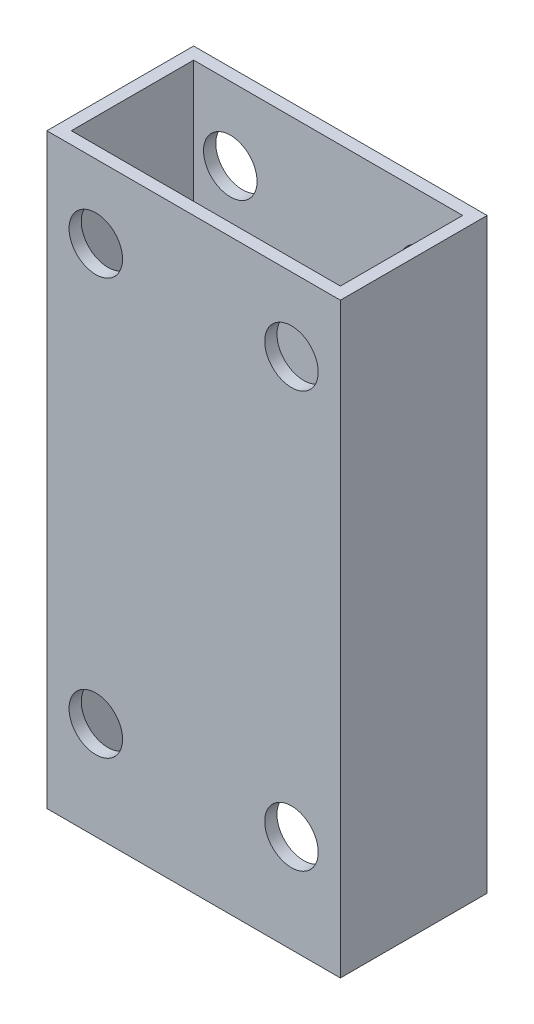
ISO-10303-21;
HEADER;
FILE_DESCRIPTION(('STEP AP214'),'2;1');
FILE_NAME('part.step','',(''),(''),'','','');
FILE_SCHEMA(('AUTOMOTIVE_DESIGN { 1 0 10303 214 1 1 1 1 }'));
ENDSEC;
DATA;
#1=APPLICATION_CONTEXT('core data for automotive mechanical design processes');
#2=APPLICATION_PROTOCOL_DEFINITION('international standard','automotive_design',2000,#1);
#3=PRODUCT_CONTEXT('',#1,'mechanical');
#4=PRODUCT('Part','Part','',(#3));
#5=PRODUCT_RELATED_PRODUCT_CATEGORY('part','',(#4));
#6=PRODUCT_DEFINITION_FORMATION('','',#4);
#7=PRODUCT_DEFINITION_CONTEXT('part definition',#1,'design');
#8=PRODUCT_DEFINITION('design','',#6,#7);
#9=PRODUCT_DEFINITION_SHAPE('','',#8);
#10=(LENGTH_UNIT() NAMED_UNIT(*) SI_UNIT(.MILLI.,.METRE.));
#11=(NAMED_UNIT(*) PLANE_ANGLE_UNIT() SI_UNIT($,.RADIAN.));
#12=(NAMED_UNIT(*) SI_UNIT($,.STERADIAN.) SOLID_ANGLE_UNIT());
#13=UNCERTAINTY_MEASURE_WITH_UNIT(LENGTH_MEASURE(1.E-05),#10,'distance_accuracy_value','');
#14=(GEOMETRIC_REPRESENTATION_CONTEXT(3) GLOBAL_UNCERTAINTY_ASSIGNED_CONTEXT((#13)) GLOBAL_UNIT_ASSIGNED_CONTEXT((#10,
#11,#12)) REPRESENTATION_CONTEXT('',''));
#15=CARTESIAN_POINT('',(0.,0.,0.));
#16=DIRECTION('',(0.,0.,1.));
#17=DIRECTION('',(1.,0.,0.));
#18=AXIS2_PLACEMENT_3D('',#15,#16,#17);
#19=CARTESIAN_POINT('',(38.1,76.2,19.05));
#20=DIRECTION('',(-1.,0.,0.));
#21=DIRECTION('',(0.,0.,1.));
#22=AXIS2_PLACEMENT_3D('',#19,#20,#21);
#23=PLANE('',#22);
#24=DIRECTION('',(0.,0.,-1.));
#25=VECTOR('',#24,1.);
#26=CARTESIAN_POINT('',(38.1,-76.2,19.05));
#27=LINE('',#26,#25);
#28=CARTESIAN_POINT('',(38.1,-76.2,19.05));
#29=VERTEX_POINT('',#28);
#30=CARTESIAN_POINT('',(38.1,-76.2,-19.05));
#31=VERTEX_POINT('',#30);
#32=EDGE_CURVE('E134',#29,#31,#27,.T.);
#33=ORIENTED_EDGE('',*,*,#32,.T.);
#34=DIRECTION('',(0.,-1.,0.));
#35=VECTOR('',#34,1.);
#36=CARTESIAN_POINT('',(38.1,76.2,-19.05));
#37=LINE('',#36,#35);
#38=CARTESIAN_POINT('',(38.1,76.2,-19.05));
#39=VERTEX_POINT('',#38);
#40=EDGE_CURVE('E11',#39,#31,#37,.T.);
#41=ORIENTED_EDGE('',*,*,#40,.F.);
#42=DIRECTION('',(0.,0.,-1.));
#43=VECTOR('',#42,1.);
#44=CARTESIAN_POINT('',(38.1,76.2,19.05));
#45=LINE('',#44,#43);
#46=CARTESIAN_POINT('',(38.1,76.2,19.05));
#47=VERTEX_POINT('',#46);
#48=EDGE_CURVE('E138',#47,#39,#45,.T.);
#49=ORIENTED_EDGE('',*,*,#48,.F.);
#50=DIRECTION('',(0.,-1.,0.));
#51=VECTOR('',#50,1.);
#52=CARTESIAN_POINT('',(38.1,76.2,19.05));
#53=LINE('',#52,#51);
#54=EDGE_CURVE('E148',#47,#29,#53,.T.);
#55=ORIENTED_EDGE('',*,*,#54,.T.);
#56=EDGE_LOOP('',(#33,#41,#49,#55));
#57=FACE_BOUND('',#56,.T.);
#58=ADVANCED_FACE('F32',(#57),#23,.F.);
#59=CARTESIAN_POINT('',(-38.1,76.2,-19.05));
#60=DIRECTION('',(0.,0.,1.));
#61=DIRECTION('',(1.,0.,0.));
#62=AXIS2_PLACEMENT_3D('',#59,#60,#61);
#63=PLANE('',#62);
#64=CARTESIAN_POINT('',(25.4,57.15,-19.05));
#65=DIRECTION('',(0.,0.,1.));
#66=DIRECTION('',(1.,0.,0.));
#67=AXIS2_PLACEMENT_3D('',#64,#65,#66);
#68=CIRCLE('',#67,6.94562999999999);
#69=CARTESIAN_POINT('',(32.34563,57.15,-19.05));
#70=VERTEX_POINT('',#69);
#71=EDGE_CURVE('E396',#70,#70,#68,.T.);
#72=ORIENTED_EDGE('',*,*,#71,.T.);
#73=EDGE_LOOP('',(#72));
#74=FACE_BOUND('',#73,.T.);
#75=CARTESIAN_POINT('',(-25.4,57.15,-19.05));
#76=DIRECTION('',(0.,0.,1.));
#77=DIRECTION('',(1.,0.,0.));
#78=AXIS2_PLACEMENT_3D('',#75,#76,#77);
#79=CIRCLE('',#78,6.94562999999999);
#80=CARTESIAN_POINT('',(-18.45437,57.15,-19.05));
#81=VERTEX_POINT('',#80);
#82=EDGE_CURVE('E170',#81,#81,#79,.T.);
#83=ORIENTED_EDGE('',*,*,#82,.T.);
#84=EDGE_LOOP('',(#83));
#85=FACE_BOUND('',#84,.T.);
#86=CARTESIAN_POINT('',(-25.4,-50.8,-19.05));
#87=DIRECTION('',(0.,0.,1.));
#88=DIRECTION('',(1.,0.,0.));
#89=AXIS2_PLACEMENT_3D('',#86,#87,#88);
#90=CIRCLE('',#89,6.94562999999999);
#91=CARTESIAN_POINT('',(-18.45437,-50.8,-19.05));
#92=VERTEX_POINT('',#91);
#93=EDGE_CURVE('E166',#92,#92,#90,.T.);
#94=ORIENTED_EDGE('',*,*,#93,.T.);
#95=EDGE_LOOP('',(#94));
#96=FACE_BOUND('',#95,.T.);
#97=CARTESIAN_POINT('',(25.4,-50.8,-19.05));
#98=DIRECTION('',(0.,0.,1.));
#99=DIRECTION('',(1.,0.,0.));
#100=AXIS2_PLACEMENT_3D('',#97,#98,#99);
#101=CIRCLE('',#100,6.94562999999999);
#102=CARTESIAN_POINT('',(32.34563,-50.8,-19.05));
#103=VERTEX_POINT('',#102);
#104=EDGE_CURVE('E195',#103,#103,#101,.T.);
#105=ORIENTED_EDGE('',*,*,#104,.T.);
#106=EDGE_LOOP('',(#105));
#107=FACE_BOUND('',#106,.T.);
#108=DIRECTION('',(-1.,0.,0.));
#109=VECTOR('',#108,1.);
#110=CARTESIAN_POINT('',(-38.1,-76.2,-19.05));
#111=LINE('',#110,#109);
#112=CARTESIAN_POINT('',(-38.1,-76.2,-19.05));
#113=VERTEX_POINT('',#112);
#114=EDGE_CURVE('E151',#31,#113,#111,.T.);
#115=ORIENTED_EDGE('',*,*,#114,.T.);
#116=DIRECTION('',(0.,-1.,0.));
#117=VECTOR('',#116,1.);
#118=CARTESIAN_POINT('',(-38.1,76.2,-19.05));
#119=LINE('',#118,#117);
#120=CARTESIAN_POINT('',(-38.1,76.2,-19.05));
#121=VERTEX_POINT('',#120);
#122=EDGE_CURVE('E40',#121,#113,#119,.T.);
#123=ORIENTED_EDGE('',*,*,#122,.F.);
#124=DIRECTION('',(-1.,0.,0.));
#125=VECTOR('',#124,1.);
#126=CARTESIAN_POINT('',(-38.1,76.2,-19.05));
#127=LINE('',#126,#125);
#128=EDGE_CURVE('E141',#39,#121,#127,.T.);
#129=ORIENTED_EDGE('',*,*,#128,.F.);
#130=ORIENTED_EDGE('',*,*,#40,.T.);
#131=EDGE_LOOP('',(#115,#123,#129,#130));
#132=FACE_BOUND('',#131,.T.);
#133=ADVANCED_FACE('F222',(#74,#85,#96,#107,#132),#63,.F.);
#134=CARTESIAN_POINT('',(-38.1,76.2,19.05));
#135=DIRECTION('',(1.,0.,0.));
#136=DIRECTION('',(0.,0.,-1.));
#137=AXIS2_PLACEMENT_3D('',#134,#135,#136);
#138=PLANE('',#137);
#139=DIRECTION('',(0.,0.,1.));
#140=VECTOR('',#139,1.);
#141=CARTESIAN_POINT('',(-38.1,-76.2,19.05));
#142=LINE('',#141,#140);
#143=CARTESIAN_POINT('',(-38.1,-76.2,19.05));
#144=VERTEX_POINT('',#143);
#145=EDGE_CURVE('E153',#113,#144,#142,.T.);
#146=ORIENTED_EDGE('',*,*,#145,.T.);
#147=DIRECTION('',(0.,-1.,0.));
#148=VECTOR('',#147,1.);
#149=CARTESIAN_POINT('',(-38.1,76.2,19.05));
#150=LINE('',#149,#148);
#151=CARTESIAN_POINT('',(-38.1,76.2,19.05));
#152=VERTEX_POINT('',#151);
#153=EDGE_CURVE('E158',#152,#144,#150,.T.);
#154=ORIENTED_EDGE('',*,*,#153,.F.);
#155=DIRECTION('',(0.,0.,1.));
#156=VECTOR('',#155,1.);
#157=CARTESIAN_POINT('',(-38.1,76.2,19.05));
#158=LINE('',#157,#156);
#159=EDGE_CURVE('E144',#121,#152,#158,.T.);
#160=ORIENTED_EDGE('',*,*,#159,.F.);
#161=ORIENTED_EDGE('',*,*,#122,.T.);
#162=EDGE_LOOP('',(#146,#154,#160,#161));
#163=FACE_BOUND('',#162,.T.);
#164=ADVANCED_FACE('F227',(#163),#138,.F.);
#165=CARTESIAN_POINT('',(-38.1,76.2,19.05));
#166=DIRECTION('',(0.,0.,-1.));
#167=DIRECTION('',(-1.,0.,0.));
#168=AXIS2_PLACEMENT_3D('',#165,#166,#167);
#169=PLANE('',#168);
#170=CARTESIAN_POINT('',(25.4,57.15,19.05));
#171=DIRECTION('',(0.,0.,1.));
#172=DIRECTION('',(1.,0.,0.));
#173=AXIS2_PLACEMENT_3D('',#170,#171,#172);
#174=CIRCLE('',#173,6.94562999999999);
#175=CARTESIAN_POINT('',(32.34563,57.15,19.05));
#176=VERTEX_POINT('',#175);
#177=EDGE_CURVE('E392',#176,#176,#174,.T.);
#178=ORIENTED_EDGE('',*,*,#177,.F.);
#179=EDGE_LOOP('',(#178));
#180=FACE_BOUND('',#179,.T.);
#181=CARTESIAN_POINT('',(-25.4,57.15,19.05));
#182=DIRECTION('',(0.,0.,1.));
#183=DIRECTION('',(1.,0.,0.));
#184=AXIS2_PLACEMENT_3D('',#181,#182,#183);
#185=CIRCLE('',#184,6.94562999999999);
#186=CARTESIAN_POINT('',(-18.45437,57.15,19.05));
#187=VERTEX_POINT('',#186);
#188=EDGE_CURVE('E177',#187,#187,#185,.T.);
#189=ORIENTED_EDGE('',*,*,#188,.F.);
#190=EDGE_LOOP('',(#189));
#191=FACE_BOUND('',#190,.T.);
#192=CARTESIAN_POINT('',(-25.4,-50.8,19.05));
#193=DIRECTION('',(0.,0.,1.));
#194=DIRECTION('',(1.,0.,0.));
#195=AXIS2_PLACEMENT_3D('',#192,#193,#194);
#196=CIRCLE('',#195,6.94562999999999);
#197=CARTESIAN_POINT('',(-18.45437,-50.8,19.05));
#198=VERTEX_POINT('',#197);
#199=EDGE_CURVE('E174',#198,#198,#196,.T.);
#200=ORIENTED_EDGE('',*,*,#199,.F.);
#201=EDGE_LOOP('',(#200));
#202=FACE_BOUND('',#201,.T.);
#203=CARTESIAN_POINT('',(25.4,-50.8,19.05));
#204=DIRECTION('',(0.,0.,1.));
#205=DIRECTION('',(1.,0.,0.));
#206=AXIS2_PLACEMENT_3D('',#203,#204,#205);
#207=CIRCLE('',#206,6.94562999999999);
#208=CARTESIAN_POINT('',(32.34563,-50.8,19.05));
#209=VERTEX_POINT('',#208);
#210=EDGE_CURVE('E192',#209,#209,#207,.T.);
#211=ORIENTED_EDGE('',*,*,#210,.F.);
#212=EDGE_LOOP('',(#211));
#213=FACE_BOUND('',#212,.T.);
#214=DIRECTION('',(1.,0.,0.));
#215=VECTOR('',#214,1.);
#216=CARTESIAN_POINT('',(-38.1,-76.2,19.05));
#217=LINE('',#216,#215);
#218=EDGE_CURVE('E142',#144,#29,#217,.T.);
#219=ORIENTED_EDGE('',*,*,#218,.T.);
#220=ORIENTED_EDGE('',*,*,#54,.F.);
#221=DIRECTION('',(1.,0.,0.));
#222=VECTOR('',#221,1.);
#223=CARTESIAN_POINT('',(-38.1,76.2,19.05));
#224=LINE('',#223,#222);
#225=EDGE_CURVE('E146',#152,#47,#224,.T.);
#226=ORIENTED_EDGE('',*,*,#225,.F.);
#227=ORIENTED_EDGE('',*,*,#153,.T.);
#228=EDGE_LOOP('',(#219,#220,#226,#227));
#229=FACE_BOUND('',#228,.T.);
#230=ADVANCED_FACE('F243',(#180,#191,#202,#213,#229),#169,.F.);
#231=CARTESIAN_POINT('',(38.1,76.2,-19.05));
#232=DIRECTION('',(0.,-1.,0.));
#233=DIRECTION('',(0.,0.,-1.));
#234=AXIS2_PLACEMENT_3D('',#231,#232,#233);
#235=PLANE('',#234);
#236=DIRECTION('',(0.,0.,-1.));
#237=VECTOR('',#236,1.);
#238=CARTESIAN_POINT('',(34.925,76.2,15.875));
#239=LINE('',#238,#237);
#240=CARTESIAN_POINT('',(34.925,76.2,15.875));
#241=VERTEX_POINT('',#240);
#242=CARTESIAN_POINT('',(34.925,76.2,-15.875));
#243=VERTEX_POINT('',#242);
#244=EDGE_CURVE('E128',#241,#243,#239,.T.);
#245=ORIENTED_EDGE('',*,*,#244,.F.);
#246=DIRECTION('',(1.,0.,0.));
#247=VECTOR('',#246,1.);
#248=CARTESIAN_POINT('',(-34.925,76.2,15.875));
#249=LINE('',#248,#247);
#250=CARTESIAN_POINT('',(-34.925,76.2,15.875));
#251=VERTEX_POINT('',#250);
#252=EDGE_CURVE('E48',#251,#241,#249,.T.);
#253=ORIENTED_EDGE('',*,*,#252,.F.);
#254=DIRECTION('',(0.,0.,1.));
#255=VECTOR('',#254,1.);
#256=CARTESIAN_POINT('',(-34.925,76.2,-15.875));
#257=LINE('',#256,#255);
#258=CARTESIAN_POINT('',(-34.925,76.2,-15.875));
#259=VERTEX_POINT('',#258);
#260=EDGE_CURVE('E116',#259,#251,#257,.T.);
#261=ORIENTED_EDGE('',*,*,#260,.F.);
#262=DIRECTION('',(-1.,0.,0.));
#263=VECTOR('',#262,1.);
#264=CARTESIAN_POINT('',(34.925,76.2,-15.875));
#265=LINE('',#264,#263);
#266=EDGE_CURVE('E119',#243,#259,#265,.T.);
#267=ORIENTED_EDGE('',*,*,#266,.F.);
#268=EDGE_LOOP('',(#245,#253,#261,#267));
#269=FACE_BOUND('',#268,.T.);
#270=ORIENTED_EDGE('',*,*,#48,.T.);
#271=ORIENTED_EDGE('',*,*,#128,.T.);
#272=ORIENTED_EDGE('',*,*,#159,.T.);
#273=ORIENTED_EDGE('',*,*,#225,.T.);
#274=EDGE_LOOP('',(#270,#271,#272,#273));
#275=FACE_BOUND('',#274,.T.);
#276=ADVANCED_FACE('F239',(#269,#275),#235,.F.);
#277=CARTESIAN_POINT('',(38.1,-76.2,-19.05));
#278=DIRECTION('',(0.,-1.,0.));
#279=DIRECTION('',(0.,0.,-1.));
#280=AXIS2_PLACEMENT_3D('',#277,#278,#279);
#281=PLANE('',#280);
#282=DIRECTION('',(1.,0.,0.));
#283=VECTOR('',#282,1.);
#284=CARTESIAN_POINT('',(-34.925,-76.2,15.875));
#285=LINE('',#284,#283);
#286=CARTESIAN_POINT('',(-34.925,-76.2,15.875));
#287=VERTEX_POINT('',#286);
#288=CARTESIAN_POINT('',(34.925,-76.2,15.875));
#289=VERTEX_POINT('',#288);
#290=EDGE_CURVE('E100',#287,#289,#285,.T.);
#291=ORIENTED_EDGE('',*,*,#290,.T.);
#292=DIRECTION('',(0.,0.,-1.));
#293=VECTOR('',#292,1.);
#294=CARTESIAN_POINT('',(34.925,-76.2,15.875));
#295=LINE('',#294,#293);
#296=CARTESIAN_POINT('',(34.925,-76.2,-15.875));
#297=VERTEX_POINT('',#296);
#298=EDGE_CURVE('E109',#289,#297,#295,.T.);
#299=ORIENTED_EDGE('',*,*,#298,.T.);
#300=DIRECTION('',(-1.,0.,0.));
#301=VECTOR('',#300,1.);
#302=CARTESIAN_POINT('',(34.925,-76.2,-15.875));
#303=LINE('',#302,#301);
#304=CARTESIAN_POINT('',(-34.925,-76.2,-15.875));
#305=VERTEX_POINT('',#304);
#306=EDGE_CURVE('E56',#297,#305,#303,.T.);
#307=ORIENTED_EDGE('',*,*,#306,.T.);
#308=DIRECTION('',(0.,0.,1.));
#309=VECTOR('',#308,1.);
#310=CARTESIAN_POINT('',(-34.925,-76.2,-15.875));
#311=LINE('',#310,#309);
#312=EDGE_CURVE('E106',#305,#287,#311,.T.);
#313=ORIENTED_EDGE('',*,*,#312,.T.);
#314=EDGE_LOOP('',(#291,#299,#307,#313));
#315=FACE_BOUND('',#314,.T.);
#316=ORIENTED_EDGE('',*,*,#32,.F.);
#317=ORIENTED_EDGE('',*,*,#218,.F.);
#318=ORIENTED_EDGE('',*,*,#145,.F.);
#319=ORIENTED_EDGE('',*,*,#114,.F.);
#320=EDGE_LOOP('',(#316,#317,#318,#319));
#321=FACE_BOUND('',#320,.T.);
#322=ADVANCED_FACE('F113',(#315,#321),#281,.T.);
#323=CARTESIAN_POINT('',(-34.925,-76.2,15.875));
#324=DIRECTION('',(0.,0.,1.));
#325=DIRECTION('',(1.,0.,0.));
#326=AXIS2_PLACEMENT_3D('',#323,#324,#325);
#327=PLANE('',#326);
#328=CARTESIAN_POINT('',(25.4,57.15,15.875));
#329=DIRECTION('',(0.,0.,1.));
#330=DIRECTION('',(1.,0.,0.));
#331=AXIS2_PLACEMENT_3D('',#328,#329,#330);
#332=CIRCLE('',#331,6.94562999999999);
#333=CARTESIAN_POINT('',(32.34563,57.15,15.875));
#334=VERTEX_POINT('',#333);
#335=EDGE_CURVE('E182',#334,#334,#332,.T.);
#336=ORIENTED_EDGE('',*,*,#335,.T.);
#337=EDGE_LOOP('',(#336));
#338=FACE_BOUND('',#337,.T.);
#339=CARTESIAN_POINT('',(-25.4,57.15,15.875));
#340=DIRECTION('',(0.,0.,1.));
#341=DIRECTION('',(1.,0.,0.));
#342=AXIS2_PLACEMENT_3D('',#339,#340,#341);
#343=CIRCLE('',#342,6.94562999999999);
#344=CARTESIAN_POINT('',(-18.45437,57.15,15.875));
#345=VERTEX_POINT('',#344);
#346=EDGE_CURVE('E169',#345,#345,#343,.T.);
#347=ORIENTED_EDGE('',*,*,#346,.T.);
#348=EDGE_LOOP('',(#347));
#349=FACE_BOUND('',#348,.T.);
#350=CARTESIAN_POINT('',(-25.4,-50.8,15.875));
#351=DIRECTION('',(0.,0.,1.));
#352=DIRECTION('',(1.,0.,0.));
#353=AXIS2_PLACEMENT_3D('',#350,#351,#352);
#354=CIRCLE('',#353,6.94562999999999);
#355=CARTESIAN_POINT('',(-18.45437,-50.8,15.875));
#356=VERTEX_POINT('',#355);
#357=EDGE_CURVE('E165',#356,#356,#354,.T.);
#358=ORIENTED_EDGE('',*,*,#357,.T.);
#359=EDGE_LOOP('',(#358));
#360=FACE_BOUND('',#359,.T.);
#361=CARTESIAN_POINT('',(25.4,-50.8,15.875));
#362=DIRECTION('',(0.,0.,1.));
#363=DIRECTION('',(1.,0.,0.));
#364=AXIS2_PLACEMENT_3D('',#361,#362,#363);
#365=CIRCLE('',#364,6.94562999999999);
#366=CARTESIAN_POINT('',(32.34563,-50.8,15.875));
#367=VERTEX_POINT('',#366);
#368=EDGE_CURVE('E197',#367,#367,#365,.T.);
#369=ORIENTED_EDGE('',*,*,#368,.T.);
#370=EDGE_LOOP('',(#369));
#371=FACE_BOUND('',#370,.T.);
#372=ORIENTED_EDGE('',*,*,#252,.T.);
#373=DIRECTION('',(0.,1.,0.));
#374=VECTOR('',#373,1.);
#375=CARTESIAN_POINT('',(34.925,-76.2,15.875));
#376=LINE('',#375,#374);
#377=EDGE_CURVE('E96',#289,#241,#376,.T.);
#378=ORIENTED_EDGE('',*,*,#377,.F.);
#379=ORIENTED_EDGE('',*,*,#290,.F.);
#380=DIRECTION('',(0.,1.,0.));
#381=VECTOR('',#380,1.);
#382=CARTESIAN_POINT('',(-34.925,-76.2,15.875));
#383=LINE('',#382,#381);
#384=EDGE_CURVE('E132',#287,#251,#383,.T.);
#385=ORIENTED_EDGE('',*,*,#384,.T.);
#386=EDGE_LOOP('',(#372,#378,#379,#385));
#387=FACE_BOUND('',#386,.T.);
#388=ADVANCED_FACE('F98',(#338,#349,#360,#371,#387),#327,.F.);
#389=CARTESIAN_POINT('',(-34.925,-76.2,-15.875));
#390=DIRECTION('',(-1.,0.,0.));
#391=DIRECTION('',(0.,0.,1.));
#392=AXIS2_PLACEMENT_3D('',#389,#390,#391);
#393=PLANE('',#392);
#394=ORIENTED_EDGE('',*,*,#260,.T.);
#395=ORIENTED_EDGE('',*,*,#384,.F.);
#396=ORIENTED_EDGE('',*,*,#312,.F.);
#397=DIRECTION('',(0.,1.,0.));
#398=VECTOR('',#397,1.);
#399=CARTESIAN_POINT('',(-34.925,-76.2,-15.875));
#400=LINE('',#399,#398);
#401=EDGE_CURVE('E135',#305,#259,#400,.T.);
#402=ORIENTED_EDGE('',*,*,#401,.T.);
#403=EDGE_LOOP('',(#394,#395,#396,#402));
#404=FACE_BOUND('',#403,.T.);
#405=ADVANCED_FACE('F259',(#404),#393,.F.);
#406=CARTESIAN_POINT('',(34.925,-76.2,-15.875));
#407=DIRECTION('',(0.,0.,-1.));
#408=DIRECTION('',(-1.,0.,0.));
#409=AXIS2_PLACEMENT_3D('',#406,#407,#408);
#410=PLANE('',#409);
#411=CARTESIAN_POINT('',(25.4,57.15,-15.875));
#412=DIRECTION('',(0.,0.,-1.));
#413=DIRECTION('',(-1.,0.,0.));
#414=AXIS2_PLACEMENT_3D('',#411,#412,#413);
#415=CIRCLE('',#414,6.94562999999999);
#416=CARTESIAN_POINT('',(18.45437,57.15,-15.875));
#417=VERTEX_POINT('',#416);
#418=EDGE_CURVE('E35',#417,#417,#415,.T.);
#419=ORIENTED_EDGE('',*,*,#418,.T.);
#420=EDGE_LOOP('',(#419));
#421=FACE_BOUND('',#420,.T.);
#422=CARTESIAN_POINT('',(-25.4,57.15,-15.875));
#423=DIRECTION('',(0.,0.,-1.));
#424=DIRECTION('',(-1.,0.,0.));
#425=AXIS2_PLACEMENT_3D('',#422,#423,#424);
#426=CIRCLE('',#425,6.94562999999999);
#427=CARTESIAN_POINT('',(-32.34563,57.15,-15.875));
#428=VERTEX_POINT('',#427);
#429=EDGE_CURVE('E167',#428,#428,#426,.T.);
#430=ORIENTED_EDGE('',*,*,#429,.T.);
#431=EDGE_LOOP('',(#430));
#432=FACE_BOUND('',#431,.T.);
#433=CARTESIAN_POINT('',(-25.4,-50.8,-15.875));
#434=DIRECTION('',(0.,0.,-1.));
#435=DIRECTION('',(-1.,0.,0.));
#436=AXIS2_PLACEMENT_3D('',#433,#434,#435);
#437=CIRCLE('',#436,6.94562999999999);
#438=CARTESIAN_POINT('',(-32.34563,-50.8,-15.875));
#439=VERTEX_POINT('',#438);
#440=EDGE_CURVE('E163',#439,#439,#437,.T.);
#441=ORIENTED_EDGE('',*,*,#440,.T.);
#442=EDGE_LOOP('',(#441));
#443=FACE_BOUND('',#442,.T.);
#444=CARTESIAN_POINT('',(25.4,-50.8,-15.875));
#445=DIRECTION('',(0.,0.,-1.));
#446=DIRECTION('',(-1.,0.,0.));
#447=AXIS2_PLACEMENT_3D('',#444,#445,#446);
#448=CIRCLE('',#447,6.94562999999999);
#449=CARTESIAN_POINT('',(18.45437,-50.8,-15.875));
#450=VERTEX_POINT('',#449);
#451=EDGE_CURVE('E122',#450,#450,#448,.T.);
#452=ORIENTED_EDGE('',*,*,#451,.T.);
#453=EDGE_LOOP('',(#452));
#454=FACE_BOUND('',#453,.T.);
#455=ORIENTED_EDGE('',*,*,#266,.T.);
#456=ORIENTED_EDGE('',*,*,#401,.F.);
#457=ORIENTED_EDGE('',*,*,#306,.F.);
#458=DIRECTION('',(0.,1.,0.));
#459=VECTOR('',#458,1.);
#460=CARTESIAN_POINT('',(34.925,-76.2,-15.875));
#461=LINE('',#460,#459);
#462=EDGE_CURVE('E105',#297,#243,#461,.T.);
#463=ORIENTED_EDGE('',*,*,#462,.T.);
#464=EDGE_LOOP('',(#455,#456,#457,#463));
#465=FACE_BOUND('',#464,.T.);
#466=ADVANCED_FACE('F204',(#421,#432,#443,#454,#465),#410,.F.);
#467=CARTESIAN_POINT('',(34.925,-76.2,15.875));
#468=DIRECTION('',(1.,0.,0.));
#469=DIRECTION('',(0.,0.,-1.));
#470=AXIS2_PLACEMENT_3D('',#467,#468,#469);
#471=PLANE('',#470);
#472=ORIENTED_EDGE('',*,*,#244,.T.);
#473=ORIENTED_EDGE('',*,*,#462,.F.);
#474=ORIENTED_EDGE('',*,*,#298,.F.);
#475=ORIENTED_EDGE('',*,*,#377,.T.);
#476=EDGE_LOOP('',(#472,#473,#474,#475));
#477=FACE_BOUND('',#476,.T.);
#478=ADVANCED_FACE('F110',(#477),#471,.F.);
#479=CARTESIAN_POINT('',(25.4,-50.8,19.05));
#480=DIRECTION('',(0.,0.,1.));
#481=DIRECTION('',(1.,0.,0.));
#482=AXIS2_PLACEMENT_3D('',#479,#480,#481);
#483=CYLINDRICAL_SURFACE('',#482,6.94562999999999);
#484=ORIENTED_EDGE('',*,*,#104,.F.);
#485=EDGE_LOOP('',(#484));
#486=FACE_BOUND('',#485,.T.);
#487=ORIENTED_EDGE('',*,*,#451,.F.);
#488=EDGE_LOOP('',(#487));
#489=FACE_BOUND('',#488,.T.);
#490=ADVANCED_FACE('F206',(#486,#489),#483,.F.);
#491=ORIENTED_EDGE('',*,*,#210,.T.);
#492=EDGE_LOOP('',(#491));
#493=FACE_BOUND('',#492,.T.);
#494=ORIENTED_EDGE('',*,*,#368,.F.);
#495=EDGE_LOOP('',(#494));
#496=FACE_BOUND('',#495,.T.);
#497=ADVANCED_FACE('F208',(#493,#496),#483,.F.);
#498=CARTESIAN_POINT('',(-25.4,-50.8,19.05));
#499=DIRECTION('',(0.,0.,1.));
#500=DIRECTION('',(1.,0.,0.));
#501=AXIS2_PLACEMENT_3D('',#498,#499,#500);
#502=CYLINDRICAL_SURFACE('',#501,6.94562999999999);
#503=ORIENTED_EDGE('',*,*,#93,.F.);
#504=EDGE_LOOP('',(#503));
#505=FACE_BOUND('',#504,.T.);
#506=ORIENTED_EDGE('',*,*,#440,.F.);
#507=EDGE_LOOP('',(#506));
#508=FACE_BOUND('',#507,.T.);
#509=ADVANCED_FACE('F215',(#505,#508),#502,.F.);
#510=ORIENTED_EDGE('',*,*,#199,.T.);
#511=EDGE_LOOP('',(#510));
#512=FACE_BOUND('',#511,.T.);
#513=ORIENTED_EDGE('',*,*,#357,.F.);
#514=EDGE_LOOP('',(#513));
#515=FACE_BOUND('',#514,.T.);
#516=ADVANCED_FACE('F339',(#512,#515),#502,.F.);
#517=CARTESIAN_POINT('',(-25.4,57.15,19.05));
#518=DIRECTION('',(0.,0.,1.));
#519=DIRECTION('',(1.,0.,0.));
#520=AXIS2_PLACEMENT_3D('',#517,#518,#519);
#521=CYLINDRICAL_SURFACE('',#520,6.94562999999999);
#522=ORIENTED_EDGE('',*,*,#82,.F.);
#523=EDGE_LOOP('',(#522));
#524=FACE_BOUND('',#523,.T.);
#525=ORIENTED_EDGE('',*,*,#429,.F.);
#526=EDGE_LOOP('',(#525));
#527=FACE_BOUND('',#526,.T.);
#528=ADVANCED_FACE('F347',(#524,#527),#521,.F.);
#529=ORIENTED_EDGE('',*,*,#188,.T.);
#530=EDGE_LOOP('',(#529));
#531=FACE_BOUND('',#530,.T.);
#532=ORIENTED_EDGE('',*,*,#346,.F.);
#533=EDGE_LOOP('',(#532));
#534=FACE_BOUND('',#533,.T.);
#535=ADVANCED_FACE('F355',(#531,#534),#521,.F.);
#536=CARTESIAN_POINT('',(25.4,57.15,19.05));
#537=DIRECTION('',(0.,0.,1.));
#538=DIRECTION('',(1.,0.,0.));
#539=AXIS2_PLACEMENT_3D('',#536,#537,#538);
#540=CYLINDRICAL_SURFACE('',#539,6.94562999999999);
#541=ORIENTED_EDGE('',*,*,#71,.F.);
#542=EDGE_LOOP('',(#541));
#543=FACE_BOUND('',#542,.T.);
#544=ORIENTED_EDGE('',*,*,#418,.F.);
#545=EDGE_LOOP('',(#544));
#546=FACE_BOUND('',#545,.T.);
#547=ADVANCED_FACE('F364',(#543,#546),#540,.F.);
#548=ORIENTED_EDGE('',*,*,#177,.T.);
#549=EDGE_LOOP('',(#548));
#550=FACE_BOUND('',#549,.T.);
#551=ORIENTED_EDGE('',*,*,#335,.F.);
#552=EDGE_LOOP('',(#551));
#553=FACE_BOUND('',#552,.T.);
#554=ADVANCED_FACE('F372',(#550,#553),#540,.F.);
#555=CLOSED_SHELL('',(#58,#133,#164,#230,#276,#322,#388,#405,#466,#478,#490,#497,#509,#516,#528,
#535,#547,#554));
#556=MANIFOLD_SOLID_BREP('B2',#555);
#557=ADVANCED_BREP_SHAPE_REPRESENTATION('',(#18,#556),#14);
#558=SHAPE_DEFINITION_REPRESENTATION(#9,#557);
ENDSEC;
END-ISO-10303-21;
